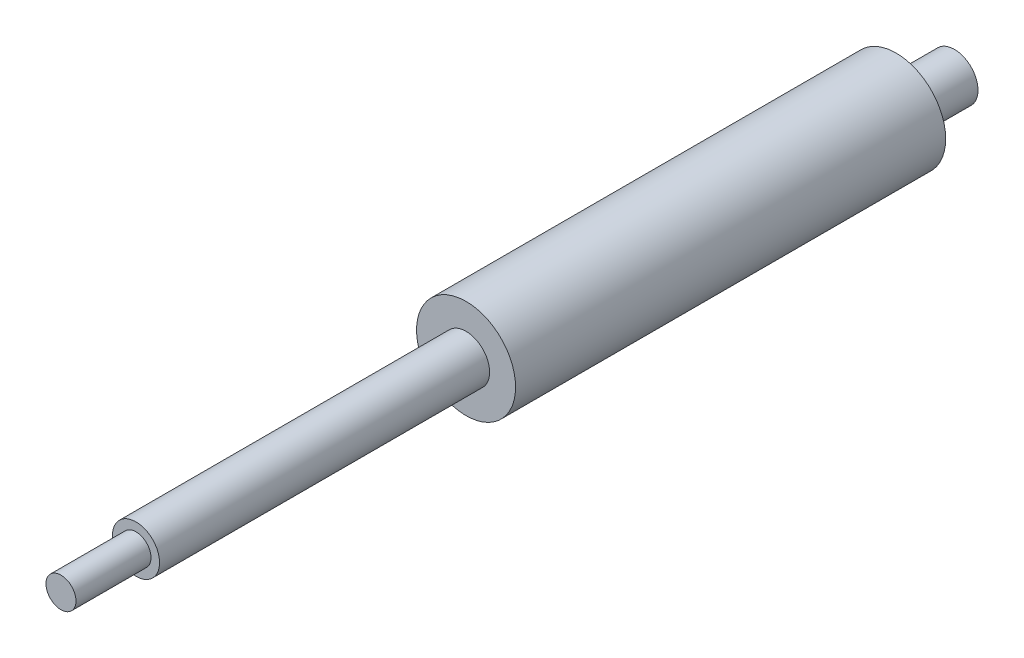
ISO-10303-21;
HEADER;
FILE_DESCRIPTION(('STEP AP214'),'2;1');
FILE_NAME('part.step','',(''),(''),'','','');
FILE_SCHEMA(('AUTOMOTIVE_DESIGN { 1 0 10303 214 1 1 1 1 }'));
ENDSEC;
DATA;
#1=APPLICATION_CONTEXT('core data for automotive mechanical design processes');
#2=APPLICATION_PROTOCOL_DEFINITION('international standard','automotive_design',2000,#1);
#3=PRODUCT_CONTEXT('',#1,'mechanical');
#4=PRODUCT('Part','Part','',(#3));
#5=PRODUCT_RELATED_PRODUCT_CATEGORY('part','',(#4));
#6=PRODUCT_DEFINITION_FORMATION('','',#4);
#7=PRODUCT_DEFINITION_CONTEXT('part definition',#1,'design');
#8=PRODUCT_DEFINITION('design','',#6,#7);
#9=PRODUCT_DEFINITION_SHAPE('','',#8);
#10=(LENGTH_UNIT() NAMED_UNIT(*) SI_UNIT(.MILLI.,.METRE.));
#11=(NAMED_UNIT(*) PLANE_ANGLE_UNIT() SI_UNIT($,.RADIAN.));
#12=(NAMED_UNIT(*) SI_UNIT($,.STERADIAN.) SOLID_ANGLE_UNIT());
#13=UNCERTAINTY_MEASURE_WITH_UNIT(LENGTH_MEASURE(1.E-05),#10,'distance_accuracy_value','');
#14=(GEOMETRIC_REPRESENTATION_CONTEXT(3) GLOBAL_UNCERTAINTY_ASSIGNED_CONTEXT((#13)) GLOBAL_UNIT_ASSIGNED_CONTEXT((#10,
#11,#12)) REPRESENTATION_CONTEXT('',''));
#15=CARTESIAN_POINT('',(0.,0.,0.));
#16=DIRECTION('',(0.,0.,1.));
#17=DIRECTION('',(1.,0.,0.));
#18=AXIS2_PLACEMENT_3D('',#15,#16,#17);
#19=CARTESIAN_POINT('',(0.,0.,86.));
#20=DIRECTION('',(0.,0.,-1.));
#21=DIRECTION('',(-1.,0.,0.));
#22=AXIS2_PLACEMENT_3D('',#19,#20,#21);
#23=CYLINDRICAL_SURFACE('',#22,9.9);
#24=CARTESIAN_POINT('',(0.,0.,86.));
#25=DIRECTION('',(0.,0.,1.));
#26=DIRECTION('',(1.,0.,0.));
#27=AXIS2_PLACEMENT_3D('',#24,#25,#26);
#28=CIRCLE('',#27,9.9);
#29=CARTESIAN_POINT('',(9.9,0.,86.));
#30=VERTEX_POINT('',#29);
#31=EDGE_CURVE('E59',#30,#30,#28,.T.);
#32=ORIENTED_EDGE('',*,*,#31,.F.);
#33=EDGE_LOOP('',(#32));
#34=FACE_BOUND('',#33,.T.);
#35=CARTESIAN_POINT('',(0.,0.,0.));
#36=DIRECTION('',(0.,0.,1.));
#37=DIRECTION('',(1.,0.,0.));
#38=AXIS2_PLACEMENT_3D('',#35,#36,#37);
#39=CIRCLE('',#38,9.9);
#40=CARTESIAN_POINT('',(9.9,0.,0.));
#41=VERTEX_POINT('',#40);
#42=EDGE_CURVE('E73',#41,#41,#39,.T.);
#43=ORIENTED_EDGE('',*,*,#42,.T.);
#44=EDGE_LOOP('',(#43));
#45=FACE_BOUND('',#44,.T.);
#46=ADVANCED_FACE('F43',(#34,#45),#23,.T.);
#47=CARTESIAN_POINT('',(0.,0.,86.));
#48=DIRECTION('',(0.,0.,1.));
#49=DIRECTION('',(1.,0.,0.));
#50=AXIS2_PLACEMENT_3D('',#47,#48,#49);
#51=PLANE('',#50);
#52=CARTESIAN_POINT('',(0.,0.,86.));
#53=DIRECTION('',(0.,0.,1.));
#54=DIRECTION('',(1.,0.,0.));
#55=AXIS2_PLACEMENT_3D('',#52,#53,#54);
#56=CIRCLE('',#55,4.7125);
#57=CARTESIAN_POINT('',(4.7125,0.,86.));
#58=VERTEX_POINT('',#57);
#59=EDGE_CURVE('E51',#58,#58,#56,.T.);
#60=ORIENTED_EDGE('',*,*,#59,.F.);
#61=EDGE_LOOP('',(#60));
#62=FACE_BOUND('',#61,.T.);
#63=ORIENTED_EDGE('',*,*,#31,.T.);
#64=EDGE_LOOP('',(#63));
#65=FACE_BOUND('',#64,.T.);
#66=ADVANCED_FACE('F100',(#62,#65),#51,.T.);
#67=CARTESIAN_POINT('',(0.,0.,0.));
#68=DIRECTION('',(0.,0.,1.));
#69=DIRECTION('',(1.,0.,0.));
#70=AXIS2_PLACEMENT_3D('',#67,#68,#69);
#71=PLANE('',#70);
#72=CARTESIAN_POINT('',(0.,0.,0.));
#73=DIRECTION('',(0.,0.,1.));
#74=DIRECTION('',(1.,0.,0.));
#75=AXIS2_PLACEMENT_3D('',#72,#73,#74);
#76=CIRCLE('',#75,4.7125);
#77=CARTESIAN_POINT('',(4.7125,0.,0.));
#78=VERTEX_POINT('',#77);
#79=EDGE_CURVE('E46',#78,#78,#76,.T.);
#80=ORIENTED_EDGE('',*,*,#79,.T.);
#81=EDGE_LOOP('',(#80));
#82=FACE_BOUND('',#81,.T.);
#83=ORIENTED_EDGE('',*,*,#42,.F.);
#84=EDGE_LOOP('',(#83));
#85=FACE_BOUND('',#84,.T.);
#86=ADVANCED_FACE('F81',(#82,#85),#71,.F.);
#87=CARTESIAN_POINT('',(0.,0.,-11.65));
#88=DIRECTION('',(0.,0.,1.));
#89=DIRECTION('',(1.,0.,0.));
#90=AXIS2_PLACEMENT_3D('',#87,#88,#89);
#91=PLANE('',#90);
#92=CARTESIAN_POINT('',(0.,0.,-11.65));
#93=DIRECTION('',(0.,0.,1.));
#94=DIRECTION('',(1.,0.,0.));
#95=AXIS2_PLACEMENT_3D('',#92,#93,#94);
#96=CIRCLE('',#95,4.7125);
#97=CARTESIAN_POINT('',(4.7125,0.,-11.65));
#98=VERTEX_POINT('',#97);
#99=EDGE_CURVE('E67',#98,#98,#96,.T.);
#100=ORIENTED_EDGE('',*,*,#99,.F.);
#101=EDGE_LOOP('',(#100));
#102=FACE_BOUND('',#101,.T.);
#103=ADVANCED_FACE('F87',(#102),#91,.F.);
#104=CARTESIAN_POINT('',(0.,0.,-11.65));
#105=DIRECTION('',(0.,0.,1.));
#106=DIRECTION('',(1.,0.,0.));
#107=AXIS2_PLACEMENT_3D('',#104,#105,#106);
#108=CYLINDRICAL_SURFACE('',#107,4.7125);
#109=ORIENTED_EDGE('',*,*,#99,.T.);
#110=EDGE_LOOP('',(#109));
#111=FACE_BOUND('',#110,.T.);
#112=ORIENTED_EDGE('',*,*,#79,.F.);
#113=EDGE_LOOP('',(#112));
#114=FACE_BOUND('',#113,.T.);
#115=ADVANCED_FACE('F84',(#111,#114),#108,.T.);
#116=ORIENTED_EDGE('',*,*,#59,.T.);
#117=EDGE_LOOP('',(#116));
#118=FACE_BOUND('',#117,.T.);
#119=CARTESIAN_POINT('',(0.,0.,152.));
#120=DIRECTION('',(0.,0.,1.));
#121=DIRECTION('',(1.,0.,0.));
#122=AXIS2_PLACEMENT_3D('',#119,#120,#121);
#123=CIRCLE('',#122,4.7125);
#124=CARTESIAN_POINT('',(4.7125,0.,152.));
#125=VERTEX_POINT('',#124);
#126=EDGE_CURVE('E64',#125,#125,#123,.T.);
#127=ORIENTED_EDGE('',*,*,#126,.F.);
#128=EDGE_LOOP('',(#127));
#129=FACE_BOUND('',#128,.T.);
#130=ADVANCED_FACE('F86',(#118,#129),#108,.T.);
#131=CARTESIAN_POINT('',(0.,0.,152.));
#132=DIRECTION('',(0.,0.,1.));
#133=DIRECTION('',(1.,0.,0.));
#134=AXIS2_PLACEMENT_3D('',#131,#132,#133);
#135=PLANE('',#134);
#136=CARTESIAN_POINT('',(0.,0.,152.));
#137=DIRECTION('',(0.,0.,1.));
#138=DIRECTION('',(1.,0.,0.));
#139=AXIS2_PLACEMENT_3D('',#136,#137,#138);
#140=CIRCLE('',#139,3.);
#141=CARTESIAN_POINT('',(3.,0.,152.));
#142=VERTEX_POINT('',#141);
#143=EDGE_CURVE('E10',#142,#142,#140,.T.);
#144=ORIENTED_EDGE('',*,*,#143,.F.);
#145=EDGE_LOOP('',(#144));
#146=FACE_BOUND('',#145,.T.);
#147=ORIENTED_EDGE('',*,*,#126,.T.);
#148=EDGE_LOOP('',(#147));
#149=FACE_BOUND('',#148,.T.);
#150=ADVANCED_FACE('F93',(#146,#149),#135,.T.);
#151=CARTESIAN_POINT('',(0.,0.,167.));
#152=DIRECTION('',(0.,0.,-1.));
#153=DIRECTION('',(-1.,0.,0.));
#154=AXIS2_PLACEMENT_3D('',#151,#152,#153);
#155=CYLINDRICAL_SURFACE('',#154,3.);
#156=CARTESIAN_POINT('',(0.,0.,167.));
#157=DIRECTION('',(0.,0.,1.));
#158=DIRECTION('',(1.,0.,0.));
#159=AXIS2_PLACEMENT_3D('',#156,#157,#158);
#160=CIRCLE('',#159,3.);
#161=CARTESIAN_POINT('',(3.,0.,167.));
#162=VERTEX_POINT('',#161);
#163=EDGE_CURVE('E63',#162,#162,#160,.T.);
#164=ORIENTED_EDGE('',*,*,#163,.F.);
#165=EDGE_LOOP('',(#164));
#166=FACE_BOUND('',#165,.T.);
#167=ORIENTED_EDGE('',*,*,#143,.T.);
#168=EDGE_LOOP('',(#167));
#169=FACE_BOUND('',#168,.T.);
#170=ADVANCED_FACE('F113',(#166,#169),#155,.T.);
#171=CARTESIAN_POINT('',(0.,0.,167.));
#172=DIRECTION('',(0.,0.,1.));
#173=DIRECTION('',(1.,0.,0.));
#174=AXIS2_PLACEMENT_3D('',#171,#172,#173);
#175=PLANE('',#174);
#176=ORIENTED_EDGE('',*,*,#163,.T.);
#177=EDGE_LOOP('',(#176));
#178=FACE_BOUND('',#177,.T.);
#179=ADVANCED_FACE('F119',(#178),#175,.T.);
#180=CLOSED_SHELL('',(#46,#66,#86,#103,#115,#130,#150,#170,#179));
#181=MANIFOLD_SOLID_BREP('B2',#180);
#182=ADVANCED_BREP_SHAPE_REPRESENTATION('',(#18,#181),#14);
#183=SHAPE_DEFINITION_REPRESENTATION(#9,#182);
ENDSEC;
END-ISO-10303-21;
